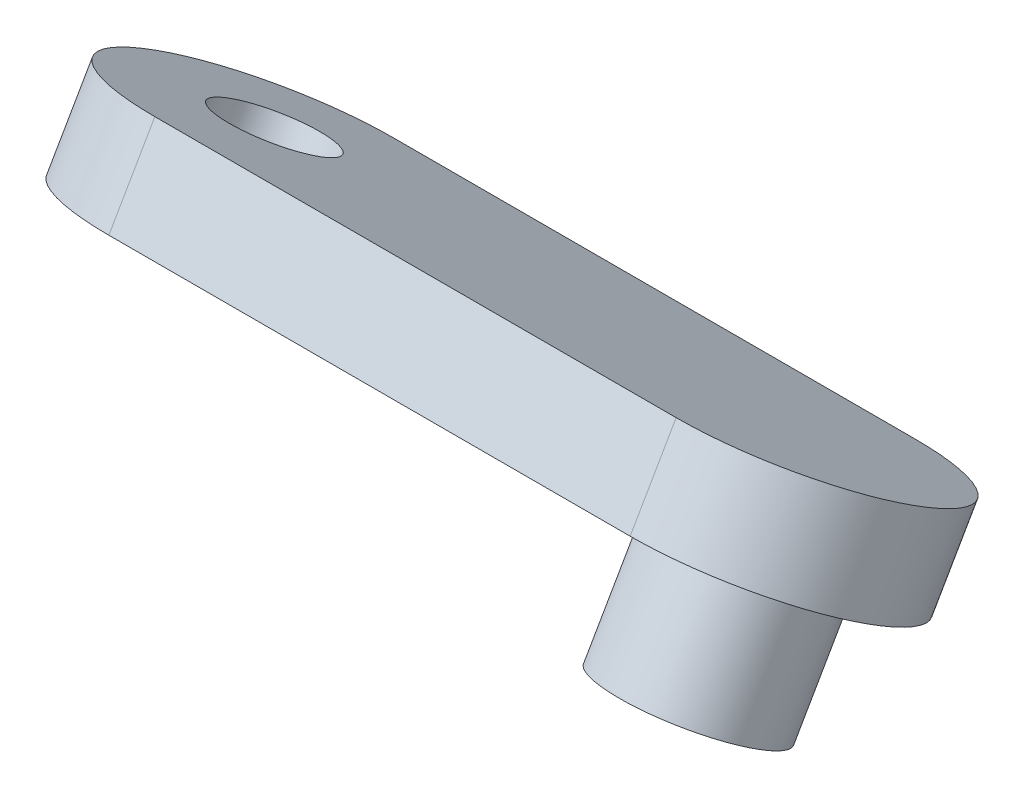
ISO-10303-21;
HEADER;
FILE_DESCRIPTION(('STEP AP214'),'2;1');
FILE_NAME('part.step','',(''),(''),'','','');
FILE_SCHEMA(('AUTOMOTIVE_DESIGN { 1 0 10303 214 1 1 1 1 }'));
ENDSEC;
DATA;
#1=APPLICATION_CONTEXT('core data for automotive mechanical design processes');
#2=APPLICATION_PROTOCOL_DEFINITION('international standard','automotive_design',2000,#1);
#3=PRODUCT_CONTEXT('',#1,'mechanical');
#4=PRODUCT('Part','Part','',(#3));
#5=PRODUCT_RELATED_PRODUCT_CATEGORY('part','',(#4));
#6=PRODUCT_DEFINITION_FORMATION('','',#4);
#7=PRODUCT_DEFINITION_CONTEXT('part definition',#1,'design');
#8=PRODUCT_DEFINITION('design','',#6,#7);
#9=PRODUCT_DEFINITION_SHAPE('','',#8);
#10=(LENGTH_UNIT() NAMED_UNIT(*) SI_UNIT(.MILLI.,.METRE.));
#11=(NAMED_UNIT(*) PLANE_ANGLE_UNIT() SI_UNIT($,.RADIAN.));
#12=(NAMED_UNIT(*) SI_UNIT($,.STERADIAN.) SOLID_ANGLE_UNIT());
#13=UNCERTAINTY_MEASURE_WITH_UNIT(LENGTH_MEASURE(1.E-05),#10,'distance_accuracy_value','');
#14=(GEOMETRIC_REPRESENTATION_CONTEXT(3) GLOBAL_UNCERTAINTY_ASSIGNED_CONTEXT((#13)) GLOBAL_UNIT_ASSIGNED_CONTEXT((#10,
#11,#12)) REPRESENTATION_CONTEXT('',''));
#15=CARTESIAN_POINT('',(0.,0.,0.));
#16=DIRECTION('',(0.,0.,1.));
#17=DIRECTION('',(1.,0.,0.));
#18=AXIS2_PLACEMENT_3D('',#15,#16,#17);
#19=CARTESIAN_POINT('',(-46.,20.852888888098,33.098263038774));
#20=DIRECTION('',(0.,-0.866025403784329,0.50000000000019));
#21=DIRECTION('',(-1.,0.,0.));
#22=AXIS2_PLACEMENT_3D('',#19,#20,#21);
#23=PLANE('',#22);
#24=CARTESIAN_POINT('',(-46.,20.852888888098,33.098263038774));
#25=DIRECTION('',(0.,-0.866025403784329,0.50000000000019));
#26=DIRECTION('',(1.,0.,0.));
#27=AXIS2_PLACEMENT_3D('',#24,#25,#26);
#28=CIRCLE('',#27,2.6);
#29=CARTESIAN_POINT('',(-43.4,20.852888888098,33.098263038774));
#30=VERTEX_POINT('',#29);
#31=EDGE_CURVE('E11',#30,#30,#28,.T.);
#32=ORIENTED_EDGE('',*,*,#31,.T.);
#33=EDGE_LOOP('',(#32));
#34=FACE_BOUND('',#33,.T.);
#35=ADVANCED_FACE('F17',(#34),#23,.T.);
#36=CARTESIAN_POINT('',(-46.,24.316990503236,31.098263038774));
#37=DIRECTION('',(0.,0.866025403784329,-0.50000000000019));
#38=DIRECTION('',(1.,0.,0.));
#39=AXIS2_PLACEMENT_3D('',#36,#37,#38);
#40=CYLINDRICAL_SURFACE('',#39,2.6);
#41=DIRECTION('',(0.,-0.866025403784329,0.50000000000019));
#42=VECTOR('',#41,1.);
#43=CARTESIAN_POINT('',(-43.4,24.316990503236,31.098263038774));
#44=LINE('',#43,#42);
#45=CARTESIAN_POINT('',(-43.4,24.308330249198,31.103263038774));
#46=VERTEX_POINT('',#45);
#47=EDGE_CURVE('E30',#46,#30,#44,.T.);
#48=ORIENTED_EDGE('',*,*,#47,.T.);
#49=ORIENTED_EDGE('',*,*,#31,.F.);
#50=ORIENTED_EDGE('',*,*,#47,.F.);
#51=CARTESIAN_POINT('',(-46.,24.308330249198,31.103263038774));
#52=DIRECTION('',(0.,0.866025403784329,-0.50000000000019));
#53=DIRECTION('',(1.,0.,0.));
#54=AXIS2_PLACEMENT_3D('',#51,#52,#53);
#55=CIRCLE('',#54,2.6);
#56=EDGE_CURVE('E130',#46,#46,#55,.T.);
#57=ORIENTED_EDGE('',*,*,#56,.F.);
#58=EDGE_LOOP('',(#48,#49,#50,#57));
#59=FACE_BOUND('',#58,.T.);
#60=ADVANCED_FACE('F19',(#59),#40,.T.);
#61=CARTESIAN_POINT('',(-63.,23.442304845413,31.603263038774));
#62=DIRECTION('',(0.,-0.866025403784329,0.50000000000019));
#63=DIRECTION('',(1.,0.,0.));
#64=AXIS2_PLACEMENT_3D('',#61,#62,#63);
#65=CYLINDRICAL_SURFACE('',#64,1.7);
#66=DIRECTION('',(0.,0.866025403784329,-0.50000000000019));
#67=VECTOR('',#66,1.);
#68=CARTESIAN_POINT('',(-61.3,23.442304845413,31.603263038774));
#69=LINE('',#68,#67);
#70=CARTESIAN_POINT('',(-61.3,24.308330249198,31.103263038774));
#71=VERTEX_POINT('',#70);
#72=CARTESIAN_POINT('',(-61.3,26.906406460551,29.603263038774));
#73=VERTEX_POINT('',#72);
#74=EDGE_CURVE('E65',#71,#73,#69,.T.);
#75=ORIENTED_EDGE('',*,*,#74,.T.);
#76=CARTESIAN_POINT('',(-63.,26.906406460551,29.603263038774));
#77=DIRECTION('',(0.,-0.866025403784329,0.50000000000019));
#78=DIRECTION('',(1.,0.,0.));
#79=AXIS2_PLACEMENT_3D('',#76,#77,#78);
#80=CIRCLE('',#79,1.7);
#81=EDGE_CURVE('E143',#73,#73,#80,.T.);
#82=ORIENTED_EDGE('',*,*,#81,.F.);
#83=ORIENTED_EDGE('',*,*,#74,.F.);
#84=CARTESIAN_POINT('',(-63.,24.308330249198,31.103263038774));
#85=DIRECTION('',(0.,-0.866025403784329,0.50000000000019));
#86=DIRECTION('',(1.,0.,0.));
#87=AXIS2_PLACEMENT_3D('',#84,#85,#86);
#88=CIRCLE('',#87,1.7);
#89=EDGE_CURVE('E123',#71,#71,#88,.T.);
#90=ORIENTED_EDGE('',*,*,#89,.T.);
#91=EDGE_LOOP('',(#75,#82,#83,#90));
#92=FACE_BOUND('',#91,.T.);
#93=ADVANCED_FACE('F169',(#92),#65,.F.);
#94=CARTESIAN_POINT('',(-46.,22.058330249198,27.206148721744));
#95=DIRECTION('',(0.,0.50000000000019,0.866025403784329));
#96=DIRECTION('',(1.,0.,0.));
#97=AXIS2_PLACEMENT_3D('',#94,#95,#96);
#98=PLANE('',#97);
#99=DIRECTION('',(-1.,0.,0.));
#100=VECTOR('',#99,1.);
#101=CARTESIAN_POINT('',(-46.,22.058330249198,27.206148721744));
#102=LINE('',#101,#100);
#103=CARTESIAN_POINT('',(-46.,22.058330249198,27.206148721744));
#104=VERTEX_POINT('',#103);
#105=CARTESIAN_POINT('',(-63.,22.058330249198,27.206148721744));
#106=VERTEX_POINT('',#105);
#107=EDGE_CURVE('E126',#104,#106,#102,.T.);
#108=ORIENTED_EDGE('',*,*,#107,.T.);
#109=DIRECTION('',(0.,0.866025403784329,-0.50000000000019));
#110=VECTOR('',#109,1.);
#111=CARTESIAN_POINT('',(-63.,22.058330249198,27.206148721744));
#112=LINE('',#111,#110);
#113=CARTESIAN_POINT('',(-63.,24.656406460551,25.706148721744));
#114=VERTEX_POINT('',#113);
#115=EDGE_CURVE('E103',#106,#114,#112,.T.);
#116=ORIENTED_EDGE('',*,*,#115,.T.);
#117=DIRECTION('',(-1.,0.,0.));
#118=VECTOR('',#117,1.);
#119=CARTESIAN_POINT('',(-46.,24.656406460551,25.706148721744));
#120=LINE('',#119,#118);
#121=CARTESIAN_POINT('',(-46.,24.656406460551,25.706148721744));
#122=VERTEX_POINT('',#121);
#123=EDGE_CURVE('E77',#122,#114,#120,.T.);
#124=ORIENTED_EDGE('',*,*,#123,.F.);
#125=DIRECTION('',(0.,0.866025403784329,-0.50000000000019));
#126=VECTOR('',#125,1.);
#127=CARTESIAN_POINT('',(-46.,22.058330249198,27.206148721744));
#128=LINE('',#127,#126);
#129=EDGE_CURVE('E138',#104,#122,#128,.T.);
#130=ORIENTED_EDGE('',*,*,#129,.F.);
#131=EDGE_LOOP('',(#108,#116,#124,#130));
#132=FACE_BOUND('',#131,.T.);
#133=ADVANCED_FACE('F172',(#132),#98,.F.);
#134=CARTESIAN_POINT('',(-54.5,26.906406460551,29.603263038774));
#135=DIRECTION('',(0.,0.866025403784329,-0.50000000000019));
#136=DIRECTION('',(-1.,0.,0.));
#137=AXIS2_PLACEMENT_3D('',#134,#135,#136);
#138=PLANE('',#137);
#139=ORIENTED_EDGE('',*,*,#81,.T.);
#140=EDGE_LOOP('',(#139));
#141=FACE_BOUND('',#140,.T.);
#142=DIRECTION('',(1.,0.,0.));
#143=VECTOR('',#142,1.);
#144=CARTESIAN_POINT('',(-63.,29.156406460551,33.500377355804));
#145=LINE('',#144,#143);
#146=CARTESIAN_POINT('',(-63.,29.156406460551,33.500377355804));
#147=VERTEX_POINT('',#146);
#148=CARTESIAN_POINT('',(-46.,29.156406460551,33.500377355804));
#149=VERTEX_POINT('',#148);
#150=EDGE_CURVE('E114',#147,#149,#145,.T.);
#151=ORIENTED_EDGE('',*,*,#150,.T.);
#152=CARTESIAN_POINT('',(-46.,26.906406460551,29.603263038774));
#153=DIRECTION('',(0.,0.866025403784329,-0.50000000000019));
#154=DIRECTION('',(0.,0.50000000000019,0.866025403784329));
#155=AXIS2_PLACEMENT_3D('',#152,#153,#154);
#156=CIRCLE('',#155,4.5);
#157=EDGE_CURVE('E140',#149,#122,#156,.T.);
#158=ORIENTED_EDGE('',*,*,#157,.T.);
#159=ORIENTED_EDGE('',*,*,#123,.T.);
#160=CARTESIAN_POINT('',(-63.,26.906406460551,29.603263038774));
#161=DIRECTION('',(0.,0.866025403784329,-0.50000000000019));
#162=DIRECTION('',(0.,-0.50000000000019,-0.866025403784329));
#163=AXIS2_PLACEMENT_3D('',#160,#161,#162);
#164=CIRCLE('',#163,4.5);
#165=EDGE_CURVE('E104',#114,#147,#164,.T.);
#166=ORIENTED_EDGE('',*,*,#165,.T.);
#167=EDGE_LOOP('',(#151,#158,#159,#166));
#168=FACE_BOUND('',#167,.T.);
#169=ADVANCED_FACE('F164',(#141,#168),#138,.T.);
#170=CARTESIAN_POINT('',(-54.5,24.308330249198,31.103263038774));
#171=DIRECTION('',(0.,0.866025403784329,-0.50000000000019));
#172=DIRECTION('',(-1.,0.,0.));
#173=AXIS2_PLACEMENT_3D('',#170,#171,#172);
#174=PLANE('',#173);
#175=ORIENTED_EDGE('',*,*,#56,.T.);
#176=EDGE_LOOP('',(#175));
#177=FACE_BOUND('',#176,.T.);
#178=ORIENTED_EDGE('',*,*,#89,.F.);
#179=EDGE_LOOP('',(#178));
#180=FACE_BOUND('',#179,.T.);
#181=CARTESIAN_POINT('',(-63.,24.308330249198,31.103263038774));
#182=DIRECTION('',(0.,0.866025403784329,-0.50000000000019));
#183=DIRECTION('',(0.,-0.50000000000019,-0.866025403784329));
#184=AXIS2_PLACEMENT_3D('',#181,#182,#183);
#185=CIRCLE('',#184,4.5);
#186=CARTESIAN_POINT('',(-63.,26.558330249198,35.000377355804));
#187=VERTEX_POINT('',#186);
#188=EDGE_CURVE('E100',#106,#187,#185,.T.);
#189=ORIENTED_EDGE('',*,*,#188,.F.);
#190=ORIENTED_EDGE('',*,*,#107,.F.);
#191=CARTESIAN_POINT('',(-46.,24.308330249198,31.103263038774));
#192=DIRECTION('',(0.,0.866025403784329,-0.50000000000019));
#193=DIRECTION('',(0.,0.50000000000019,0.866025403784329));
#194=AXIS2_PLACEMENT_3D('',#191,#192,#193);
#195=CIRCLE('',#194,4.5);
#196=CARTESIAN_POINT('',(-46.,26.558330249198,35.000377355804));
#197=VERTEX_POINT('',#196);
#198=EDGE_CURVE('E86',#197,#104,#195,.T.);
#199=ORIENTED_EDGE('',*,*,#198,.F.);
#200=DIRECTION('',(1.,0.,0.));
#201=VECTOR('',#200,1.);
#202=CARTESIAN_POINT('',(-63.,26.558330249198,35.000377355804));
#203=LINE('',#202,#201);
#204=EDGE_CURVE('E112',#187,#197,#203,.T.);
#205=ORIENTED_EDGE('',*,*,#204,.F.);
#206=EDGE_LOOP('',(#189,#190,#199,#205));
#207=FACE_BOUND('',#206,.T.);
#208=ADVANCED_FACE('F116',(#177,#180,#207),#174,.F.);
#209=CARTESIAN_POINT('',(-46.,24.308330249198,31.103263038774));
#210=DIRECTION('',(0.,-0.866025403784329,0.50000000000019));
#211=DIRECTION('',(0.,0.50000000000019,0.866025403784329));
#212=AXIS2_PLACEMENT_3D('',#209,#210,#211);
#213=CYLINDRICAL_SURFACE('',#212,4.5);
#214=ORIENTED_EDGE('',*,*,#198,.T.);
#215=ORIENTED_EDGE('',*,*,#129,.T.);
#216=ORIENTED_EDGE('',*,*,#157,.F.);
#217=DIRECTION('',(0.,0.866025403784329,-0.50000000000019));
#218=VECTOR('',#217,1.);
#219=CARTESIAN_POINT('',(-46.,26.558330249198,35.000377355804));
#220=LINE('',#219,#218);
#221=EDGE_CURVE('E119',#197,#149,#220,.T.);
#222=ORIENTED_EDGE('',*,*,#221,.F.);
#223=EDGE_LOOP('',(#214,#215,#216,#222));
#224=FACE_BOUND('',#223,.T.);
#225=ADVANCED_FACE('F163',(#224),#213,.T.);
#226=CARTESIAN_POINT('',(-63.,24.308330249198,31.103263038774));
#227=DIRECTION('',(0.,-0.866025403784329,0.50000000000019));
#228=DIRECTION('',(0.,-0.50000000000019,-0.866025403784329));
#229=AXIS2_PLACEMENT_3D('',#226,#227,#228);
#230=CYLINDRICAL_SURFACE('',#229,4.5);
#231=ORIENTED_EDGE('',*,*,#188,.T.);
#232=DIRECTION('',(0.,0.866025403784329,-0.50000000000019));
#233=VECTOR('',#232,1.);
#234=CARTESIAN_POINT('',(-63.,26.558330249198,35.000377355804));
#235=LINE('',#234,#233);
#236=EDGE_CURVE('E101',#187,#147,#235,.T.);
#237=ORIENTED_EDGE('',*,*,#236,.T.);
#238=ORIENTED_EDGE('',*,*,#165,.F.);
#239=ORIENTED_EDGE('',*,*,#115,.F.);
#240=EDGE_LOOP('',(#231,#237,#238,#239));
#241=FACE_BOUND('',#240,.T.);
#242=ADVANCED_FACE('F97',(#241),#230,.T.);
#243=CARTESIAN_POINT('',(-63.,26.558330249198,35.000377355804));
#244=DIRECTION('',(0.,-0.50000000000019,-0.866025403784329));
#245=DIRECTION('',(0.,-0.866025403784329,0.50000000000019));
#246=AXIS2_PLACEMENT_3D('',#243,#244,#245);
#247=PLANE('',#246);
#248=ORIENTED_EDGE('',*,*,#204,.T.);
#249=ORIENTED_EDGE('',*,*,#221,.T.);
#250=ORIENTED_EDGE('',*,*,#150,.F.);
#251=ORIENTED_EDGE('',*,*,#236,.F.);
#252=EDGE_LOOP('',(#248,#249,#250,#251));
#253=FACE_BOUND('',#252,.T.);
#254=ADVANCED_FACE('F108',(#253),#247,.F.);
#255=CLOSED_SHELL('',(#35,#60,#93,#133,#169,#208,#225,#242,#254));
#256=MANIFOLD_SOLID_BREP('B1',#255);
#257=ADVANCED_BREP_SHAPE_REPRESENTATION('',(#18,#256),#14);
#258=SHAPE_DEFINITION_REPRESENTATION(#9,#257);
ENDSEC;
END-ISO-10303-21;
